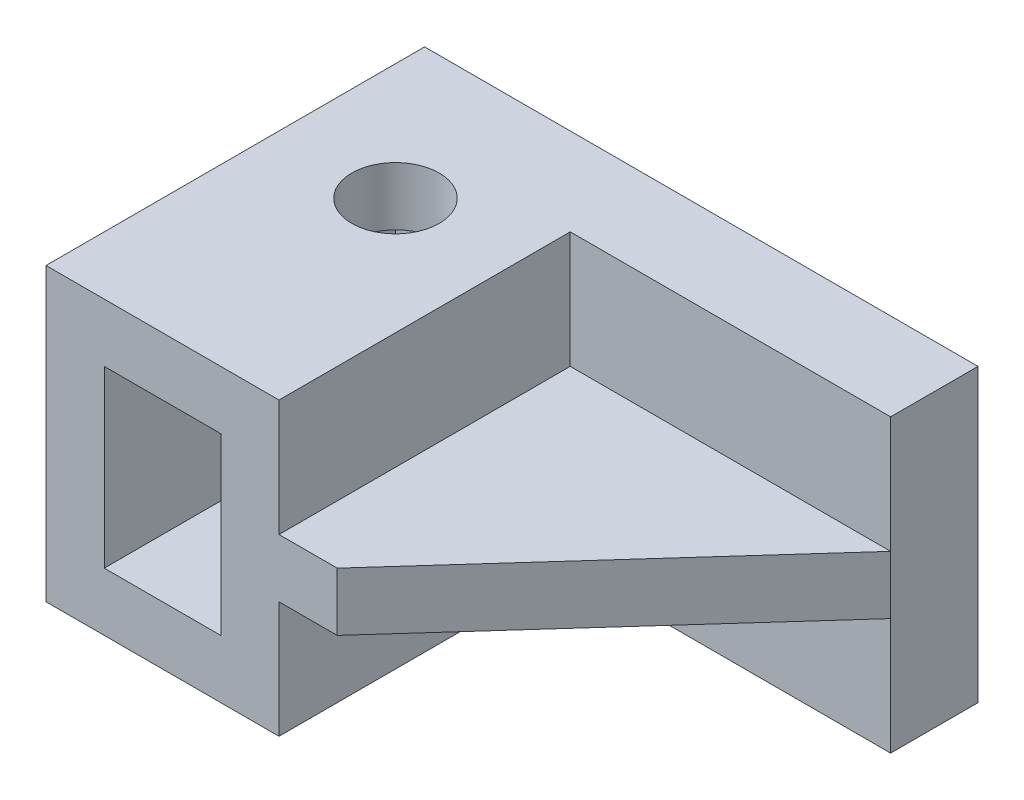
ISO-10303-21;
HEADER;
FILE_DESCRIPTION(('STEP AP214'),'2;1');
FILE_NAME('part.step','',(''),(''),'','','');
FILE_SCHEMA(('AUTOMOTIVE_DESIGN { 1 0 10303 214 1 1 1 1 }'));
ENDSEC;
DATA;
#1=APPLICATION_CONTEXT('core data for automotive mechanical design processes');
#2=APPLICATION_PROTOCOL_DEFINITION('international standard','automotive_design',2000,#1);
#3=PRODUCT_CONTEXT('',#1,'mechanical');
#4=PRODUCT('Part','Part','',(#3));
#5=PRODUCT_RELATED_PRODUCT_CATEGORY('part','',(#4));
#6=PRODUCT_DEFINITION_FORMATION('','',#4);
#7=PRODUCT_DEFINITION_CONTEXT('part definition',#1,'design');
#8=PRODUCT_DEFINITION('design','',#6,#7);
#9=PRODUCT_DEFINITION_SHAPE('','',#8);
#10=(LENGTH_UNIT() NAMED_UNIT(*) SI_UNIT(.MILLI.,.METRE.));
#11=(NAMED_UNIT(*) PLANE_ANGLE_UNIT() SI_UNIT($,.RADIAN.));
#12=(NAMED_UNIT(*) SI_UNIT($,.STERADIAN.) SOLID_ANGLE_UNIT());
#13=UNCERTAINTY_MEASURE_WITH_UNIT(LENGTH_MEASURE(1.E-05),#10,'distance_accuracy_value','');
#14=(GEOMETRIC_REPRESENTATION_CONTEXT(3) GLOBAL_UNCERTAINTY_ASSIGNED_CONTEXT((#13)) GLOBAL_UNIT_ASSIGNED_CONTEXT((#10,
#11,#12)) REPRESENTATION_CONTEXT('',''));
#15=CARTESIAN_POINT('',(0.,0.,0.));
#16=DIRECTION('',(0.,0.,1.));
#17=DIRECTION('',(1.,0.,0.));
#18=AXIS2_PLACEMENT_3D('',#15,#16,#17);
#19=CARTESIAN_POINT('',(0.,0.,381.));
#20=DIRECTION('',(0.,0.,1.));
#21=DIRECTION('',(1.,0.,0.));
#22=AXIS2_PLACEMENT_3D('',#19,#20,#21);
#23=PLANE('',#22);
#24=DIRECTION('',(-1.,0.,0.));
#25=VECTOR('',#24,1.);
#26=CARTESIAN_POINT('',(1016.,762.,381.));
#27=LINE('',#26,#25);
#28=CARTESIAN_POINT('',(2413.,762.,381.));
#29=VERTEX_POINT('',#28);
#30=CARTESIAN_POINT('',(1016.,762.,381.));
#31=VERTEX_POINT('',#30);
#32=EDGE_CURVE('E146',#29,#31,#27,.T.);
#33=ORIENTED_EDGE('',*,*,#32,.F.);
#34=DIRECTION('',(0.,1.,0.));
#35=VECTOR('',#34,1.);
#36=CARTESIAN_POINT('',(2413.,0.,381.));
#37=LINE('',#36,#35);
#38=CARTESIAN_POINT('',(2413.,1270.,381.));
#39=VERTEX_POINT('',#38);
#40=EDGE_CURVE('E150',#29,#39,#37,.T.);
#41=ORIENTED_EDGE('',*,*,#40,.T.);
#42=DIRECTION('',(-1.,0.,0.));
#43=VECTOR('',#42,1.);
#44=CARTESIAN_POINT('',(2413.,1270.,381.));
#45=LINE('',#44,#43);
#46=CARTESIAN_POINT('',(1016.,1270.,381.));
#47=VERTEX_POINT('',#46);
#48=EDGE_CURVE('E186',#39,#47,#45,.T.);
#49=ORIENTED_EDGE('',*,*,#48,.T.);
#50=DIRECTION('',(0.,1.,0.));
#51=VECTOR('',#50,1.);
#52=CARTESIAN_POINT('',(1016.,0.,381.));
#53=LINE('',#52,#51);
#54=EDGE_CURVE('E152',#31,#47,#53,.T.);
#55=ORIENTED_EDGE('',*,*,#54,.F.);
#56=EDGE_LOOP('',(#33,#41,#49,#55));
#57=FACE_BOUND('',#56,.T.);
#58=ADVANCED_FACE('F43',(#57),#23,.T.);
#59=CARTESIAN_POINT('',(1016.,0.,1651.));
#60=DIRECTION('',(-1.,0.,0.));
#61=DIRECTION('',(0.,0.,1.));
#62=AXIS2_PLACEMENT_3D('',#59,#60,#61);
#63=PLANE('',#62);
#64=DIRECTION('',(0.,1.,0.));
#65=VECTOR('',#64,1.);
#66=CARTESIAN_POINT('',(1016.,0.,1651.));
#67=LINE('',#66,#65);
#68=CARTESIAN_POINT('',(1016.,762.,1651.));
#69=VERTEX_POINT('',#68);
#70=CARTESIAN_POINT('',(1016.,1270.,1651.));
#71=VERTEX_POINT('',#70);
#72=EDGE_CURVE('E237',#69,#71,#67,.T.);
#73=ORIENTED_EDGE('',*,*,#72,.F.);
#74=DIRECTION('',(0.,0.,1.));
#75=VECTOR('',#74,1.);
#76=CARTESIAN_POINT('',(1016.,762.,381.));
#77=LINE('',#76,#75);
#78=EDGE_CURVE('E268',#31,#69,#77,.T.);
#79=ORIENTED_EDGE('',*,*,#78,.F.);
#80=ORIENTED_EDGE('',*,*,#54,.T.);
#81=DIRECTION('',(0.,0.,-1.));
#82=VECTOR('',#81,1.);
#83=CARTESIAN_POINT('',(1016.,1270.,1651.));
#84=LINE('',#83,#82);
#85=EDGE_CURVE('E251',#71,#47,#84,.T.);
#86=ORIENTED_EDGE('',*,*,#85,.F.);
#87=EDGE_LOOP('',(#73,#79,#80,#86));
#88=FACE_BOUND('',#87,.T.);
#89=ADVANCED_FACE('F351',(#88),#63,.F.);
#90=CARTESIAN_POINT('',(0.,1270.,381.));
#91=DIRECTION('',(1.,0.,0.));
#92=DIRECTION('',(0.,0.,-1.));
#93=AXIS2_PLACEMENT_3D('',#90,#91,#92);
#94=PLANE('',#93);
#95=DIRECTION('',(0.,-1.,0.));
#96=VECTOR('',#95,1.);
#97=CARTESIAN_POINT('',(0.,1270.,0.));
#98=LINE('',#97,#96);
#99=CARTESIAN_POINT('',(0.,1270.,0.));
#100=VERTEX_POINT('',#99);
#101=CARTESIAN_POINT('',(0.,0.,0.));
#102=VERTEX_POINT('',#101);
#103=EDGE_CURVE('E194',#100,#102,#98,.T.);
#104=ORIENTED_EDGE('',*,*,#103,.T.);
#105=DIRECTION('',(0.,0.,-1.));
#106=VECTOR('',#105,1.);
#107=CARTESIAN_POINT('',(0.,0.,381.));
#108=LINE('',#107,#106);
#109=CARTESIAN_POINT('',(0.,0.,1651.));
#110=VERTEX_POINT('',#109);
#111=EDGE_CURVE('E11',#110,#102,#108,.T.);
#112=ORIENTED_EDGE('',*,*,#111,.F.);
#113=DIRECTION('',(0.,-1.,0.));
#114=VECTOR('',#113,1.);
#115=CARTESIAN_POINT('',(0.,0.,1651.));
#116=LINE('',#115,#114);
#117=CARTESIAN_POINT('',(0.,1270.,1651.));
#118=VERTEX_POINT('',#117);
#119=EDGE_CURVE('E229',#118,#110,#116,.T.);
#120=ORIENTED_EDGE('',*,*,#119,.F.);
#121=DIRECTION('',(0.,0.,-1.));
#122=VECTOR('',#121,1.);
#123=CARTESIAN_POINT('',(0.,1270.,381.));
#124=LINE('',#123,#122);
#125=EDGE_CURVE('E193',#118,#100,#124,.T.);
#126=ORIENTED_EDGE('',*,*,#125,.T.);
#127=EDGE_LOOP('',(#104,#112,#120,#126));
#128=FACE_BOUND('',#127,.T.);
#129=ADVANCED_FACE('F45',(#128),#94,.F.);
#130=CARTESIAN_POINT('',(0.,0.,381.));
#131=DIRECTION('',(0.,1.,0.));
#132=DIRECTION('',(0.,0.,1.));
#133=AXIS2_PLACEMENT_3D('',#130,#131,#132);
#134=PLANE('',#133);
#135=CARTESIAN_POINT('',(508.,0.,635.));
#136=DIRECTION('',(0.,1.,0.));
#137=DIRECTION('',(0.,0.,1.));
#138=AXIS2_PLACEMENT_3D('',#135,#136,#137);
#139=CIRCLE('',#138,190.5);
#140=CARTESIAN_POINT('',(508.,-2.22044604925031E-13,444.5));
#141=VERTEX_POINT('',#140);
#142=EDGE_CURVE('E378',#141,#141,#139,.T.);
#143=ORIENTED_EDGE('',*,*,#142,.T.);
#144=EDGE_LOOP('',(#143));
#145=FACE_BOUND('',#144,.T.);
#146=DIRECTION('',(1.,0.,0.));
#147=VECTOR('',#146,1.);
#148=CARTESIAN_POINT('',(0.,0.,0.));
#149=LINE('',#148,#147);
#150=CARTESIAN_POINT('',(2413.,0.,0.));
#151=VERTEX_POINT('',#150);
#152=EDGE_CURVE('E198',#102,#151,#149,.T.);
#153=ORIENTED_EDGE('',*,*,#152,.T.);
#154=DIRECTION('',(0.,0.,-1.));
#155=VECTOR('',#154,1.);
#156=CARTESIAN_POINT('',(2413.,0.,381.));
#157=LINE('',#156,#155);
#158=CARTESIAN_POINT('',(2413.,0.,381.));
#159=VERTEX_POINT('',#158);
#160=EDGE_CURVE('E53',#159,#151,#157,.T.);
#161=ORIENTED_EDGE('',*,*,#160,.F.);
#162=DIRECTION('',(1.,0.,0.));
#163=VECTOR('',#162,1.);
#164=CARTESIAN_POINT('',(0.,0.,381.));
#165=LINE('',#164,#163);
#166=CARTESIAN_POINT('',(1016.,0.,381.));
#167=VERTEX_POINT('',#166);
#168=EDGE_CURVE('E182',#167,#159,#165,.T.);
#169=ORIENTED_EDGE('',*,*,#168,.F.);
#170=DIRECTION('',(0.,0.,-1.));
#171=VECTOR('',#170,1.);
#172=CARTESIAN_POINT('',(1016.,0.,1651.));
#173=LINE('',#172,#171);
#174=CARTESIAN_POINT('',(1016.,0.,1651.));
#175=VERTEX_POINT('',#174);
#176=EDGE_CURVE('E199',#175,#167,#173,.T.);
#177=ORIENTED_EDGE('',*,*,#176,.F.);
#178=DIRECTION('',(1.,0.,0.));
#179=VECTOR('',#178,1.);
#180=CARTESIAN_POINT('',(0.,0.,1651.));
#181=LINE('',#180,#179);
#182=EDGE_CURVE('E232',#110,#175,#181,.T.);
#183=ORIENTED_EDGE('',*,*,#182,.F.);
#184=ORIENTED_EDGE('',*,*,#111,.T.);
#185=EDGE_LOOP('',(#153,#161,#169,#177,#183,#184));
#186=FACE_BOUND('',#185,.T.);
#187=ADVANCED_FACE('F262',(#145,#186),#134,.F.);
#188=CARTESIAN_POINT('',(2413.,0.,381.));
#189=DIRECTION('',(-1.,0.,0.));
#190=DIRECTION('',(0.,0.,1.));
#191=AXIS2_PLACEMENT_3D('',#188,#189,#190);
#192=PLANE('',#191);
#193=DIRECTION('',(0.,1.,0.));
#194=VECTOR('',#193,1.);
#195=CARTESIAN_POINT('',(2413.,0.,0.));
#196=LINE('',#195,#194);
#197=CARTESIAN_POINT('',(2413.,1270.,0.));
#198=VERTEX_POINT('',#197);
#199=EDGE_CURVE('E202',#151,#198,#196,.T.);
#200=ORIENTED_EDGE('',*,*,#199,.T.);
#201=DIRECTION('',(0.,0.,-1.));
#202=VECTOR('',#201,1.);
#203=CARTESIAN_POINT('',(2413.,1270.,381.));
#204=LINE('',#203,#202);
#205=EDGE_CURVE('E178',#39,#198,#204,.T.);
#206=ORIENTED_EDGE('',*,*,#205,.F.);
#207=ORIENTED_EDGE('',*,*,#40,.F.);
#208=DIRECTION('',(0.,-1.,0.));
#209=VECTOR('',#208,1.);
#210=CARTESIAN_POINT('',(2413.,762.,381.));
#211=LINE('',#210,#209);
#212=CARTESIAN_POINT('',(2413.,508.,381.));
#213=VERTEX_POINT('',#212);
#214=EDGE_CURVE('E163',#29,#213,#211,.T.);
#215=ORIENTED_EDGE('',*,*,#214,.T.);
#216=EDGE_CURVE('E181',#159,#213,#37,.T.);
#217=ORIENTED_EDGE('',*,*,#216,.F.);
#218=ORIENTED_EDGE('',*,*,#160,.T.);
#219=EDGE_LOOP('',(#200,#206,#207,#215,#217,#218));
#220=FACE_BOUND('',#219,.T.);
#221=ADVANCED_FACE('F176',(#220),#192,.F.);
#222=CARTESIAN_POINT('',(2413.,1270.,381.));
#223=DIRECTION('',(0.,-1.,0.));
#224=DIRECTION('',(0.,0.,-1.));
#225=AXIS2_PLACEMENT_3D('',#222,#223,#224);
#226=PLANE('',#225);
#227=CARTESIAN_POINT('',(508.,1270.,635.));
#228=DIRECTION('',(0.,-1.,0.));
#229=DIRECTION('',(0.,0.,-1.));
#230=AXIS2_PLACEMENT_3D('',#227,#228,#229);
#231=CIRCLE('',#230,190.5);
#232=CARTESIAN_POINT('',(508.,1270.,444.5));
#233=VERTEX_POINT('',#232);
#234=EDGE_CURVE('E389',#233,#233,#231,.T.);
#235=ORIENTED_EDGE('',*,*,#234,.T.);
#236=EDGE_LOOP('',(#235));
#237=FACE_BOUND('',#236,.T.);
#238=DIRECTION('',(-1.,0.,0.));
#239=VECTOR('',#238,1.);
#240=CARTESIAN_POINT('',(2413.,1270.,0.));
#241=LINE('',#240,#239);
#242=EDGE_CURVE('E187',#198,#100,#241,.T.);
#243=ORIENTED_EDGE('',*,*,#242,.T.);
#244=ORIENTED_EDGE('',*,*,#125,.F.);
#245=DIRECTION('',(-1.,0.,0.));
#246=VECTOR('',#245,1.);
#247=CARTESIAN_POINT('',(0.,1270.,1651.));
#248=LINE('',#247,#246);
#249=EDGE_CURVE('E249',#71,#118,#248,.T.);
#250=ORIENTED_EDGE('',*,*,#249,.F.);
#251=ORIENTED_EDGE('',*,*,#85,.T.);
#252=ORIENTED_EDGE('',*,*,#48,.F.);
#253=ORIENTED_EDGE('',*,*,#205,.T.);
#254=EDGE_LOOP('',(#243,#244,#250,#251,#252,#253));
#255=FACE_BOUND('',#254,.T.);
#256=ADVANCED_FACE('F223',(#237,#255),#226,.F.);
#257=ORIENTED_EDGE('',*,*,#216,.T.);
#258=DIRECTION('',(1.,0.,0.));
#259=VECTOR('',#258,1.);
#260=CARTESIAN_POINT('',(1270.,508.,381.));
#261=LINE('',#260,#259);
#262=CARTESIAN_POINT('',(1016.,508.,381.));
#263=VERTEX_POINT('',#262);
#264=EDGE_CURVE('E157',#263,#213,#261,.T.);
#265=ORIENTED_EDGE('',*,*,#264,.F.);
#266=EDGE_CURVE('E233',#167,#263,#53,.T.);
#267=ORIENTED_EDGE('',*,*,#266,.F.);
#268=ORIENTED_EDGE('',*,*,#168,.T.);
#269=EDGE_LOOP('',(#257,#265,#267,#268));
#270=FACE_BOUND('',#269,.T.);
#271=ADVANCED_FACE('F264',(#270),#23,.T.);
#272=CARTESIAN_POINT('',(0.,0.,0.));
#273=DIRECTION('',(0.,0.,1.));
#274=DIRECTION('',(1.,0.,0.));
#275=AXIS2_PLACEMENT_3D('',#272,#273,#274);
#276=PLANE('',#275);
#277=ORIENTED_EDGE('',*,*,#103,.F.);
#278=ORIENTED_EDGE('',*,*,#242,.F.);
#279=ORIENTED_EDGE('',*,*,#199,.F.);
#280=ORIENTED_EDGE('',*,*,#152,.F.);
#281=EDGE_LOOP('',(#277,#278,#279,#280));
#282=FACE_BOUND('',#281,.T.);
#283=ADVANCED_FACE('F221',(#282),#276,.F.);
#284=ORIENTED_EDGE('',*,*,#266,.T.);
#285=DIRECTION('',(0.,0.,1.));
#286=VECTOR('',#285,1.);
#287=CARTESIAN_POINT('',(1016.,508.,381.));
#288=LINE('',#287,#286);
#289=CARTESIAN_POINT('',(1016.,508.,1651.));
#290=VERTEX_POINT('',#289);
#291=EDGE_CURVE('E271',#263,#290,#288,.T.);
#292=ORIENTED_EDGE('',*,*,#291,.T.);
#293=EDGE_CURVE('E245',#175,#290,#67,.T.);
#294=ORIENTED_EDGE('',*,*,#293,.F.);
#295=ORIENTED_EDGE('',*,*,#176,.T.);
#296=EDGE_LOOP('',(#284,#292,#294,#295));
#297=FACE_BOUND('',#296,.T.);
#298=ADVANCED_FACE('F260',(#297),#63,.F.);
#299=CARTESIAN_POINT('',(0.,0.,1651.));
#300=DIRECTION('',(0.,0.,-1.));
#301=DIRECTION('',(-1.,0.,0.));
#302=AXIS2_PLACEMENT_3D('',#299,#300,#301);
#303=PLANE('',#302);
#304=DIRECTION('',(1.,0.,0.));
#305=VECTOR('',#304,1.);
#306=CARTESIAN_POINT('',(254.,254.,1651.));
#307=LINE('',#306,#305);
#308=CARTESIAN_POINT('',(254.,254.,1651.));
#309=VERTEX_POINT('',#308);
#310=CARTESIAN_POINT('',(762.,254.,1651.));
#311=VERTEX_POINT('',#310);
#312=EDGE_CURVE('E303',#309,#311,#307,.T.);
#313=ORIENTED_EDGE('',*,*,#312,.F.);
#314=DIRECTION('',(0.,-1.,0.));
#315=VECTOR('',#314,1.);
#316=CARTESIAN_POINT('',(254.,1016.,1651.));
#317=LINE('',#316,#315);
#318=CARTESIAN_POINT('',(254.,1016.,1651.));
#319=VERTEX_POINT('',#318);
#320=EDGE_CURVE('E68',#319,#309,#317,.T.);
#321=ORIENTED_EDGE('',*,*,#320,.F.);
#322=DIRECTION('',(-1.,0.,0.));
#323=VECTOR('',#322,1.);
#324=CARTESIAN_POINT('',(254.,1016.,1651.));
#325=LINE('',#324,#323);
#326=CARTESIAN_POINT('',(762.,1016.,1651.));
#327=VERTEX_POINT('',#326);
#328=EDGE_CURVE('E289',#327,#319,#325,.T.);
#329=ORIENTED_EDGE('',*,*,#328,.F.);
#330=DIRECTION('',(0.,1.,0.));
#331=VECTOR('',#330,1.);
#332=CARTESIAN_POINT('',(762.,1016.,1651.));
#333=LINE('',#332,#331);
#334=EDGE_CURVE('E307',#311,#327,#333,.T.);
#335=ORIENTED_EDGE('',*,*,#334,.F.);
#336=EDGE_LOOP('',(#313,#321,#329,#335));
#337=FACE_BOUND('',#336,.T.);
#338=ORIENTED_EDGE('',*,*,#119,.T.);
#339=ORIENTED_EDGE('',*,*,#182,.T.);
#340=ORIENTED_EDGE('',*,*,#293,.T.);
#341=DIRECTION('',(1.,0.,0.));
#342=VECTOR('',#341,1.);
#343=CARTESIAN_POINT('',(1270.,508.,1651.));
#344=LINE('',#343,#342);
#345=CARTESIAN_POINT('',(1270.,508.,1651.));
#346=VERTEX_POINT('',#345);
#347=EDGE_CURVE('E276',#290,#346,#344,.T.);
#348=ORIENTED_EDGE('',*,*,#347,.T.);
#349=DIRECTION('',(0.,1.,0.));
#350=VECTOR('',#349,1.);
#351=CARTESIAN_POINT('',(1270.,762.,1651.));
#352=LINE('',#351,#350);
#353=CARTESIAN_POINT('',(1270.,762.,1651.));
#354=VERTEX_POINT('',#353);
#355=EDGE_CURVE('E158',#346,#354,#352,.T.);
#356=ORIENTED_EDGE('',*,*,#355,.T.);
#357=DIRECTION('',(-1.,0.,0.));
#358=VECTOR('',#357,1.);
#359=CARTESIAN_POINT('',(1016.,762.,1651.));
#360=LINE('',#359,#358);
#361=EDGE_CURVE('E60',#354,#69,#360,.T.);
#362=ORIENTED_EDGE('',*,*,#361,.T.);
#363=ORIENTED_EDGE('',*,*,#72,.T.);
#364=ORIENTED_EDGE('',*,*,#249,.T.);
#365=EDGE_LOOP('',(#338,#339,#340,#348,#356,#362,#363,#364));
#366=FACE_BOUND('',#365,.T.);
#367=ADVANCED_FACE('F331',(#337,#366),#303,.F.);
#368=CARTESIAN_POINT('',(254.,1016.,381.));
#369=DIRECTION('',(-1.,0.,0.));
#370=DIRECTION('',(0.,0.,1.));
#371=AXIS2_PLACEMENT_3D('',#368,#369,#370);
#372=PLANE('',#371);
#373=ORIENTED_EDGE('',*,*,#320,.T.);
#374=DIRECTION('',(0.,0.,1.));
#375=VECTOR('',#374,1.);
#376=CARTESIAN_POINT('',(254.,254.,381.));
#377=LINE('',#376,#375);
#378=CARTESIAN_POINT('',(254.,254.,381.));
#379=VERTEX_POINT('',#378);
#380=EDGE_CURVE('E242',#379,#309,#377,.T.);
#381=ORIENTED_EDGE('',*,*,#380,.F.);
#382=DIRECTION('',(0.,-1.,0.));
#383=VECTOR('',#382,1.);
#384=CARTESIAN_POINT('',(254.,1016.,381.));
#385=LINE('',#384,#383);
#386=CARTESIAN_POINT('',(254.,1016.,381.));
#387=VERTEX_POINT('',#386);
#388=EDGE_CURVE('E284',#387,#379,#385,.T.);
#389=ORIENTED_EDGE('',*,*,#388,.F.);
#390=DIRECTION('',(0.,0.,1.));
#391=VECTOR('',#390,1.);
#392=CARTESIAN_POINT('',(254.,1016.,381.));
#393=LINE('',#392,#391);
#394=EDGE_CURVE('E314',#387,#319,#393,.T.);
#395=ORIENTED_EDGE('',*,*,#394,.T.);
#396=EDGE_LOOP('',(#373,#381,#389,#395));
#397=FACE_BOUND('',#396,.T.);
#398=ADVANCED_FACE('F339',(#397),#372,.F.);
#399=CARTESIAN_POINT('',(254.,1016.,381.));
#400=DIRECTION('',(0.,1.,0.));
#401=DIRECTION('',(0.,0.,1.));
#402=AXIS2_PLACEMENT_3D('',#399,#400,#401);
#403=PLANE('',#402);
#404=CARTESIAN_POINT('',(508.,1016.,635.));
#405=DIRECTION('',(0.,1.,0.));
#406=DIRECTION('',(0.,0.,1.));
#407=AXIS2_PLACEMENT_3D('',#404,#405,#406);
#408=CIRCLE('',#407,190.5);
#409=CARTESIAN_POINT('',(508.,1016.,444.5));
#410=VERTEX_POINT('',#409);
#411=EDGE_CURVE('E381',#410,#410,#408,.T.);
#412=ORIENTED_EDGE('',*,*,#411,.T.);
#413=EDGE_LOOP('',(#412));
#414=FACE_BOUND('',#413,.T.);
#415=ORIENTED_EDGE('',*,*,#328,.T.);
#416=ORIENTED_EDGE('',*,*,#394,.F.);
#417=DIRECTION('',(-1.,0.,0.));
#418=VECTOR('',#417,1.);
#419=CARTESIAN_POINT('',(254.,1016.,381.));
#420=LINE('',#419,#418);
#421=CARTESIAN_POINT('',(762.,1016.,381.));
#422=VERTEX_POINT('',#421);
#423=EDGE_CURVE('E297',#422,#387,#420,.T.);
#424=ORIENTED_EDGE('',*,*,#423,.F.);
#425=DIRECTION('',(0.,0.,1.));
#426=VECTOR('',#425,1.);
#427=CARTESIAN_POINT('',(762.,1016.,381.));
#428=LINE('',#427,#426);
#429=EDGE_CURVE('E317',#422,#327,#428,.T.);
#430=ORIENTED_EDGE('',*,*,#429,.T.);
#431=EDGE_LOOP('',(#415,#416,#424,#430));
#432=FACE_BOUND('',#431,.T.);
#433=ADVANCED_FACE('F338',(#414,#432),#403,.F.);
#434=CARTESIAN_POINT('',(762.,1016.,381.));
#435=DIRECTION('',(1.,0.,0.));
#436=DIRECTION('',(0.,0.,-1.));
#437=AXIS2_PLACEMENT_3D('',#434,#435,#436);
#438=PLANE('',#437);
#439=ORIENTED_EDGE('',*,*,#334,.T.);
#440=ORIENTED_EDGE('',*,*,#429,.F.);
#441=DIRECTION('',(0.,1.,0.));
#442=VECTOR('',#441,1.);
#443=CARTESIAN_POINT('',(762.,1016.,381.));
#444=LINE('',#443,#442);
#445=CARTESIAN_POINT('',(762.,254.,381.));
#446=VERTEX_POINT('',#445);
#447=EDGE_CURVE('E293',#446,#422,#444,.T.);
#448=ORIENTED_EDGE('',*,*,#447,.F.);
#449=DIRECTION('',(0.,0.,1.));
#450=VECTOR('',#449,1.);
#451=CARTESIAN_POINT('',(762.,254.,381.));
#452=LINE('',#451,#450);
#453=EDGE_CURVE('E319',#446,#311,#452,.T.);
#454=ORIENTED_EDGE('',*,*,#453,.T.);
#455=EDGE_LOOP('',(#439,#440,#448,#454));
#456=FACE_BOUND('',#455,.T.);
#457=ADVANCED_FACE('F333',(#456),#438,.F.);
#458=CARTESIAN_POINT('',(254.,254.,381.));
#459=DIRECTION('',(0.,-1.,0.));
#460=DIRECTION('',(0.,0.,-1.));
#461=AXIS2_PLACEMENT_3D('',#458,#459,#460);
#462=PLANE('',#461);
#463=CARTESIAN_POINT('',(508.,254.,635.));
#464=DIRECTION('',(0.,-1.,0.));
#465=DIRECTION('',(0.,0.,-1.));
#466=AXIS2_PLACEMENT_3D('',#463,#464,#465);
#467=CIRCLE('',#466,190.5);
#468=CARTESIAN_POINT('',(508.,254.,444.5));
#469=VERTEX_POINT('',#468);
#470=EDGE_CURVE('E47',#469,#469,#467,.T.);
#471=ORIENTED_EDGE('',*,*,#470,.T.);
#472=EDGE_LOOP('',(#471));
#473=FACE_BOUND('',#472,.T.);
#474=ORIENTED_EDGE('',*,*,#312,.T.);
#475=ORIENTED_EDGE('',*,*,#453,.F.);
#476=DIRECTION('',(1.,0.,0.));
#477=VECTOR('',#476,1.);
#478=CARTESIAN_POINT('',(254.,254.,381.));
#479=LINE('',#478,#477);
#480=EDGE_CURVE('E288',#379,#446,#479,.T.);
#481=ORIENTED_EDGE('',*,*,#480,.F.);
#482=ORIENTED_EDGE('',*,*,#380,.T.);
#483=EDGE_LOOP('',(#474,#475,#481,#482));
#484=FACE_BOUND('',#483,.T.);
#485=ADVANCED_FACE('F327',(#473,#484),#462,.F.);
#486=CARTESIAN_POINT('',(0.,0.,381.));
#487=DIRECTION('',(0.,0.,1.));
#488=DIRECTION('',(1.,0.,0.));
#489=AXIS2_PLACEMENT_3D('',#486,#487,#488);
#490=PLANE('',#489);
#491=ORIENTED_EDGE('',*,*,#388,.T.);
#492=ORIENTED_EDGE('',*,*,#480,.T.);
#493=ORIENTED_EDGE('',*,*,#447,.T.);
#494=ORIENTED_EDGE('',*,*,#423,.T.);
#495=EDGE_LOOP('',(#491,#492,#493,#494));
#496=FACE_BOUND('',#495,.T.);
#497=ADVANCED_FACE('F337',(#496),#490,.T.);
#498=CARTESIAN_POINT('',(1016.,762.,381.));
#499=DIRECTION('',(0.,1.,0.));
#500=DIRECTION('',(0.,0.,1.));
#501=AXIS2_PLACEMENT_3D('',#498,#499,#500);
#502=PLANE('',#501);
#503=ORIENTED_EDGE('',*,*,#361,.F.);
#504=DIRECTION('',(-0.66896473162245,0.,0.743294146247166));
#505=VECTOR('',#504,1.);
#506=CARTESIAN_POINT('',(1270.,762.,1651.));
#507=LINE('',#506,#505);
#508=EDGE_CURVE('E166',#29,#354,#507,.T.);
#509=ORIENTED_EDGE('',*,*,#508,.F.);
#510=ORIENTED_EDGE('',*,*,#32,.T.);
#511=ORIENTED_EDGE('',*,*,#78,.T.);
#512=EDGE_LOOP('',(#503,#509,#510,#511));
#513=FACE_BOUND('',#512,.T.);
#514=ADVANCED_FACE('F173',(#513),#502,.T.);
#515=CARTESIAN_POINT('',(1270.,508.,381.));
#516=DIRECTION('',(0.,-1.,0.));
#517=DIRECTION('',(0.,0.,-1.));
#518=AXIS2_PLACEMENT_3D('',#515,#516,#517);
#519=PLANE('',#518);
#520=ORIENTED_EDGE('',*,*,#347,.F.);
#521=ORIENTED_EDGE('',*,*,#291,.F.);
#522=ORIENTED_EDGE('',*,*,#264,.T.);
#523=DIRECTION('',(-0.66896473162245,0.,0.743294146247166));
#524=VECTOR('',#523,1.);
#525=CARTESIAN_POINT('',(1270.,508.,1651.));
#526=LINE('',#525,#524);
#527=EDGE_CURVE('E167',#213,#346,#526,.T.);
#528=ORIENTED_EDGE('',*,*,#527,.T.);
#529=EDGE_LOOP('',(#520,#521,#522,#528));
#530=FACE_BOUND('',#529,.T.);
#531=ADVANCED_FACE('F406',(#530),#519,.T.);
#532=CARTESIAN_POINT('',(1270.,762.,1651.));
#533=DIRECTION('',(0.743294146247166,0.,0.66896473162245));
#534=DIRECTION('',(0.66896473162245,0.,-0.743294146247166));
#535=AXIS2_PLACEMENT_3D('',#532,#533,#534);
#536=PLANE('',#535);
#537=ORIENTED_EDGE('',*,*,#527,.F.);
#538=ORIENTED_EDGE('',*,*,#214,.F.);
#539=ORIENTED_EDGE('',*,*,#508,.T.);
#540=ORIENTED_EDGE('',*,*,#355,.F.);
#541=EDGE_LOOP('',(#537,#538,#539,#540));
#542=FACE_BOUND('',#541,.T.);
#543=ADVANCED_FACE('F164',(#542),#536,.T.);
#544=CARTESIAN_POINT('',(508.,1270.,635.));
#545=DIRECTION('',(0.,-1.,0.));
#546=DIRECTION('',(0.,0.,-1.));
#547=AXIS2_PLACEMENT_3D('',#544,#545,#546);
#548=CYLINDRICAL_SURFACE('',#547,190.5);
#549=CARTESIAN_POINT('',(508.,254.,444.5));
#550=CARTESIAN_POINT('',(508.,251.354166666667,444.5));
#551=CARTESIAN_POINT('',(508.,248.708333333334,444.5));
#552=CARTESIAN_POINT('',(508.,243.416666666667,444.5));
#553=CARTESIAN_POINT('',(508.,240.770833333334,444.5));
#554=CARTESIAN_POINT('',(508.,235.479166666667,444.5));
#555=CARTESIAN_POINT('',(508.,232.833333333334,444.5));
#556=CARTESIAN_POINT('',(508.,227.541666666667,444.5));
#557=CARTESIAN_POINT('',(508.,224.895833333333,444.5));
#558=CARTESIAN_POINT('',(508.,219.604166666667,444.5));
#559=CARTESIAN_POINT('',(508.,216.958333333333,444.5));
#560=CARTESIAN_POINT('',(508.,211.666666666667,444.5));
#561=CARTESIAN_POINT('',(508.,209.020833333334,444.5));
#562=CARTESIAN_POINT('',(508.,203.729166666667,444.5));
#563=CARTESIAN_POINT('',(508.,201.083333333333,444.5));
#564=CARTESIAN_POINT('',(508.,195.791666666667,444.5));
#565=CARTESIAN_POINT('',(508.,193.145833333333,444.5));
#566=CARTESIAN_POINT('',(508.,187.854166666667,444.5));
#567=CARTESIAN_POINT('',(508.,185.208333333334,444.5));
#568=CARTESIAN_POINT('',(508.,179.916666666667,444.5));
#569=CARTESIAN_POINT('',(508.,177.270833333333,444.5));
#570=CARTESIAN_POINT('',(508.,171.979166666667,444.5));
#571=CARTESIAN_POINT('',(508.,169.333333333333,444.5));
#572=CARTESIAN_POINT('',(508.,164.041666666667,444.5));
#573=CARTESIAN_POINT('',(508.,161.395833333333,444.5));
#574=CARTESIAN_POINT('',(508.,156.104166666667,444.5));
#575=CARTESIAN_POINT('',(508.,153.458333333333,444.5));
#576=CARTESIAN_POINT('',(508.,148.166666666667,444.5));
#577=CARTESIAN_POINT('',(508.,145.520833333333,444.5));
#578=CARTESIAN_POINT('',(508.,140.229166666667,444.5));
#579=CARTESIAN_POINT('',(508.,137.583333333333,444.5));
#580=CARTESIAN_POINT('',(508.,132.291666666667,444.5));
#581=CARTESIAN_POINT('',(508.,129.645833333333,444.5));
#582=CARTESIAN_POINT('',(508.,124.354166666667,444.5));
#583=CARTESIAN_POINT('',(508.,121.708333333333,444.5));
#584=CARTESIAN_POINT('',(508.,116.416666666667,444.5));
#585=CARTESIAN_POINT('',(508.,113.770833333333,444.5));
#586=CARTESIAN_POINT('',(508.,108.479166666667,444.5));
#587=CARTESIAN_POINT('',(508.,105.833333333333,444.5));
#588=CARTESIAN_POINT('',(508.,100.541666666667,444.5));
#589=CARTESIAN_POINT('',(508.,97.8958333333332,444.5));
#590=CARTESIAN_POINT('',(508.,92.6041666666665,444.5));
#591=CARTESIAN_POINT('',(508.,89.9583333333332,444.5));
#592=CARTESIAN_POINT('',(508.,84.6666666666666,444.5));
#593=CARTESIAN_POINT('',(508.,82.0208333333333,444.5));
#594=CARTESIAN_POINT('',(508.,76.7291666666666,444.5));
#595=CARTESIAN_POINT('',(508.,74.0833333333332,444.5));
#596=CARTESIAN_POINT('',(508.,68.7916666666665,444.5));
#597=CARTESIAN_POINT('',(508.,66.1458333333332,444.5));
#598=CARTESIAN_POINT('',(508.,60.8541666666666,444.5));
#599=CARTESIAN_POINT('',(508.,58.2083333333333,444.5));
#600=CARTESIAN_POINT('',(508.,52.9166666666666,444.5));
#601=CARTESIAN_POINT('',(508.,50.2708333333332,444.5));
#602=CARTESIAN_POINT('',(508.,44.9791666666665,444.5));
#603=CARTESIAN_POINT('',(508.,42.3333333333332,444.5));
#604=CARTESIAN_POINT('',(508.,37.0416666666666,444.5));
#605=CARTESIAN_POINT('',(508.,34.3958333333333,444.5));
#606=CARTESIAN_POINT('',(508.,29.1041666666666,444.5));
#607=CARTESIAN_POINT('',(508.,26.4583333333332,444.5));
#608=CARTESIAN_POINT('',(508.,21.1666666666665,444.5));
#609=CARTESIAN_POINT('',(508.,18.5208333333332,444.5));
#610=CARTESIAN_POINT('',(508.,13.2291666666665,444.5));
#611=CARTESIAN_POINT('',(508.,10.5833333333331,444.5));
#612=CARTESIAN_POINT('',(508.,5.2916666666664,444.5));
#613=CARTESIAN_POINT('',(508.,2.64583333333309,444.5));
#614=CARTESIAN_POINT('',(508.,-2.22044604925031E-13,444.5));
#615=B_SPLINE_CURVE_WITH_KNOTS('',3,(#549,#550,#551,#552,#553,#554,#555,#556,#557,#558,#559,
#560,#561,#562,#563,#564,#565,#566,#567,#568,#569,#570,#571,#572,#573,#574,#575,#576,#577,#578,
#579,#580,#581,#582,#583,#584,#585,#586,#587,#588,#589,#590,#591,#592,#593,#594,#595,#596,#597,
#598,#599,#600,#601,#602,#603,#604,#605,#606,#607,#608,#609,#610,#611,#612,#613,#614),
.UNSPECIFIED.,.F.,.F.,(4,2,2,2,2,2,2,2,2,2,2,2,2,2,2,2,2,2,2,2,2,2,2,2,2,2,2,2,2,2,2,2,4),(0.,
7.93749999999993,15.8750000000001,23.8125,31.7500000000002,39.6875000000001,47.625,
55.5625000000002,63.5000000000001,71.4375,79.3750000000002,87.3125000000001,95.2500000000001,
103.1875,111.125,119.0625,127.,134.9375,142.875,150.8125,158.75,166.6875,174.625,182.5625,190.5,
198.4375,206.375,214.3125,222.25,230.1875,238.125,246.062500000001,254.),.UNSPECIFIED.);
#616=EDGE_CURVE('BSEAM397',#469,#141,#615,.T.);
#617=ORIENTED_EDGE('',*,*,#470,.F.);
#618=ORIENTED_EDGE('',*,*,#142,.F.);
#619=ORIENTED_EDGE('',*,*,#616,.T.);
#620=ORIENTED_EDGE('',*,*,#616,.F.);
#621=EDGE_LOOP('',(#617,#619,#618,#620));
#622=FACE_BOUND('',#621,.T.);
#623=ADVANCED_FACE('F397',(#622),#548,.F.);
#624=CARTESIAN_POINT('',(508.,1270.,444.5));
#625=CARTESIAN_POINT('',(508.,1267.35416666667,444.5));
#626=CARTESIAN_POINT('',(508.,1264.70833333333,444.5));
#627=CARTESIAN_POINT('',(508.,1259.41666666667,444.5));
#628=CARTESIAN_POINT('',(508.,1256.77083333333,444.5));
#629=CARTESIAN_POINT('',(508.,1251.47916666667,444.5));
#630=CARTESIAN_POINT('',(508.,1248.83333333333,444.5));
#631=CARTESIAN_POINT('',(508.,1243.54166666667,444.5));
#632=CARTESIAN_POINT('',(508.,1240.89583333333,444.5));
#633=CARTESIAN_POINT('',(508.,1235.60416666667,444.5));
#634=CARTESIAN_POINT('',(508.,1232.95833333333,444.5));
#635=CARTESIAN_POINT('',(508.,1227.66666666667,444.5));
#636=CARTESIAN_POINT('',(508.,1225.02083333333,444.5));
#637=CARTESIAN_POINT('',(508.,1219.72916666667,444.5));
#638=CARTESIAN_POINT('',(508.,1217.08333333333,444.5));
#639=CARTESIAN_POINT('',(508.,1211.79166666667,444.5));
#640=CARTESIAN_POINT('',(508.,1209.14583333333,444.5));
#641=CARTESIAN_POINT('',(508.,1203.85416666667,444.5));
#642=CARTESIAN_POINT('',(508.,1201.20833333333,444.5));
#643=CARTESIAN_POINT('',(508.,1195.91666666667,444.5));
#644=CARTESIAN_POINT('',(508.,1193.27083333333,444.5));
#645=CARTESIAN_POINT('',(508.,1187.97916666667,444.5));
#646=CARTESIAN_POINT('',(508.,1185.33333333333,444.5));
#647=CARTESIAN_POINT('',(508.,1180.04166666667,444.5));
#648=CARTESIAN_POINT('',(508.,1177.39583333333,444.5));
#649=CARTESIAN_POINT('',(508.,1172.10416666667,444.5));
#650=CARTESIAN_POINT('',(508.,1169.45833333333,444.5));
#651=CARTESIAN_POINT('',(508.,1164.16666666667,444.5));
#652=CARTESIAN_POINT('',(508.,1161.52083333333,444.5));
#653=CARTESIAN_POINT('',(508.,1156.22916666667,444.5));
#654=CARTESIAN_POINT('',(508.,1153.58333333333,444.5));
#655=CARTESIAN_POINT('',(508.,1148.29166666667,444.5));
#656=CARTESIAN_POINT('',(508.,1145.64583333333,444.5));
#657=CARTESIAN_POINT('',(508.,1140.35416666667,444.5));
#658=CARTESIAN_POINT('',(508.,1137.70833333333,444.5));
#659=CARTESIAN_POINT('',(508.,1132.41666666667,444.5));
#660=CARTESIAN_POINT('',(508.,1129.77083333333,444.5));
#661=CARTESIAN_POINT('',(508.,1124.47916666667,444.5));
#662=CARTESIAN_POINT('',(508.,1121.83333333333,444.5));
#663=CARTESIAN_POINT('',(508.,1116.54166666667,444.5));
#664=CARTESIAN_POINT('',(508.,1113.89583333333,444.5));
#665=CARTESIAN_POINT('',(508.,1108.60416666667,444.5));
#666=CARTESIAN_POINT('',(508.,1105.95833333333,444.5));
#667=CARTESIAN_POINT('',(508.,1100.66666666667,444.5));
#668=CARTESIAN_POINT('',(508.,1098.02083333333,444.5));
#669=CARTESIAN_POINT('',(508.,1092.72916666667,444.5));
#670=CARTESIAN_POINT('',(508.,1090.08333333333,444.5));
#671=CARTESIAN_POINT('',(508.,1084.79166666667,444.5));
#672=CARTESIAN_POINT('',(508.,1082.14583333333,444.5));
#673=CARTESIAN_POINT('',(508.,1076.85416666667,444.5));
#674=CARTESIAN_POINT('',(508.,1074.20833333333,444.5));
#675=CARTESIAN_POINT('',(508.,1068.91666666667,444.5));
#676=CARTESIAN_POINT('',(508.,1066.27083333333,444.5));
#677=CARTESIAN_POINT('',(508.,1060.97916666667,444.5));
#678=CARTESIAN_POINT('',(508.,1058.33333333333,444.5));
#679=CARTESIAN_POINT('',(508.,1053.04166666667,444.5));
#680=CARTESIAN_POINT('',(508.,1050.39583333333,444.5));
#681=CARTESIAN_POINT('',(508.,1045.10416666667,444.5));
#682=CARTESIAN_POINT('',(508.,1042.45833333333,444.5));
#683=CARTESIAN_POINT('',(508.,1037.16666666667,444.5));
#684=CARTESIAN_POINT('',(508.,1034.52083333333,444.5));
#685=CARTESIAN_POINT('',(508.,1029.22916666667,444.5));
#686=CARTESIAN_POINT('',(508.,1026.58333333333,444.5));
#687=CARTESIAN_POINT('',(508.,1021.29166666667,444.5));
#688=CARTESIAN_POINT('',(508.,1018.64583333333,444.5));
#689=CARTESIAN_POINT('',(508.,1016.,444.5));
#690=B_SPLINE_CURVE_WITH_KNOTS('',3,(#624,#625,#626,#627,#628,#629,#630,#631,#632,#633,#634,
#635,#636,#637,#638,#639,#640,#641,#642,#643,#644,#645,#646,#647,#648,#649,#650,#651,#652,#653,
#654,#655,#656,#657,#658,#659,#660,#661,#662,#663,#664,#665,#666,#667,#668,#669,#670,#671,#672,
#673,#674,#675,#676,#677,#678,#679,#680,#681,#682,#683,#684,#685,#686,#687,#688,#689),
.UNSPECIFIED.,.F.,.F.,(4,2,2,2,2,2,2,2,2,2,2,2,2,2,2,2,2,2,2,2,2,2,2,2,2,2,2,2,2,2,2,2,4),(0.,
7.93749999999993,15.8749999999999,23.8125,31.7499999999999,39.6874999999999,47.625,55.5625,
63.4999999999999,71.4375,79.375,87.3124999999999,95.2500000000001,103.1875,111.125,119.0625,
127.,134.9375,142.875,150.8125,158.75,166.6875,174.625,182.5625,190.5,198.4375,206.375,214.3125,
222.25,230.1875,238.125,246.0625,254.),.UNSPECIFIED.);
#691=EDGE_CURVE('BSEAM399',#233,#410,#690,.T.);
#692=ORIENTED_EDGE('',*,*,#234,.F.);
#693=ORIENTED_EDGE('',*,*,#411,.F.);
#694=ORIENTED_EDGE('',*,*,#691,.T.);
#695=ORIENTED_EDGE('',*,*,#691,.F.);
#696=EDGE_LOOP('',(#692,#694,#693,#695));
#697=FACE_BOUND('',#696,.T.);
#698=ADVANCED_FACE('F399',(#697),#548,.F.);
#699=CLOSED_SHELL('',(#58,#89,#129,#187,#221,#256,#271,#283,#298,#367,#398,#433,#457,#485,#497,
#514,#531,#543,#623,#698));
#700=MANIFOLD_SOLID_BREP('B2',#699);
#701=ADVANCED_BREP_SHAPE_REPRESENTATION('',(#18,#700),#14);
#702=SHAPE_DEFINITION_REPRESENTATION(#9,#701);
ENDSEC;
END-ISO-10303-21;
